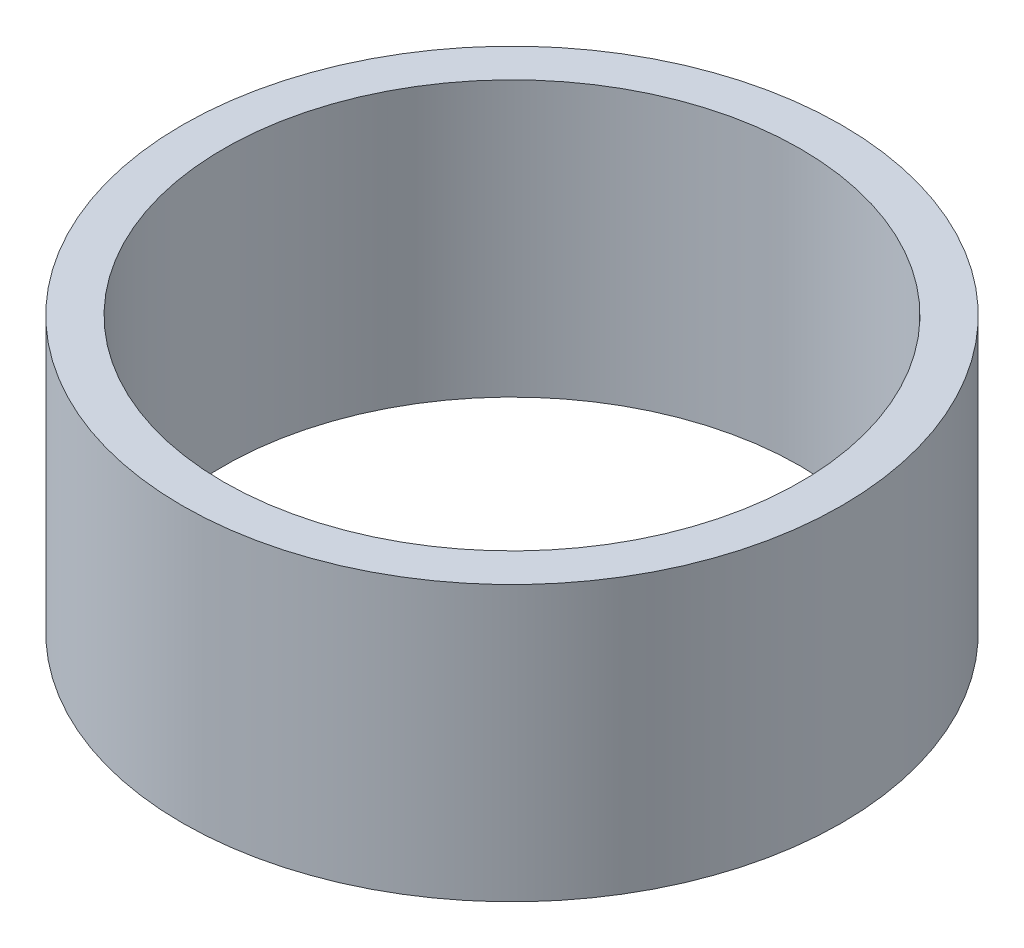
ISO-10303-21;
HEADER;
FILE_DESCRIPTION(('STEP AP214'),'2;1');
FILE_NAME('part.step','',(''),(''),'','','');
FILE_SCHEMA(('AUTOMOTIVE_DESIGN { 1 0 10303 214 1 1 1 1 }'));
ENDSEC;
DATA;
#1=APPLICATION_CONTEXT('core data for automotive mechanical design processes');
#2=APPLICATION_PROTOCOL_DEFINITION('international standard','automotive_design',2000,#1);
#3=PRODUCT_CONTEXT('',#1,'mechanical');
#4=PRODUCT('Part','Part','',(#3));
#5=PRODUCT_RELATED_PRODUCT_CATEGORY('part','',(#4));
#6=PRODUCT_DEFINITION_FORMATION('','',#4);
#7=PRODUCT_DEFINITION_CONTEXT('part definition',#1,'design');
#8=PRODUCT_DEFINITION('design','',#6,#7);
#9=PRODUCT_DEFINITION_SHAPE('','',#8);
#10=(LENGTH_UNIT() NAMED_UNIT(*) SI_UNIT(.MILLI.,.METRE.));
#11=(NAMED_UNIT(*) PLANE_ANGLE_UNIT() SI_UNIT($,.RADIAN.));
#12=(NAMED_UNIT(*) SI_UNIT($,.STERADIAN.) SOLID_ANGLE_UNIT());
#13=UNCERTAINTY_MEASURE_WITH_UNIT(LENGTH_MEASURE(1.E-05),#10,'distance_accuracy_value','');
#14=(GEOMETRIC_REPRESENTATION_CONTEXT(3) GLOBAL_UNCERTAINTY_ASSIGNED_CONTEXT((#13)) GLOBAL_UNIT_ASSIGNED_CONTEXT((#10,
#11,#12)) REPRESENTATION_CONTEXT('',''));
#15=CARTESIAN_POINT('',(0.,0.,0.));
#16=DIRECTION('',(0.,0.,1.));
#17=DIRECTION('',(1.,0.,0.));
#18=AXIS2_PLACEMENT_3D('',#15,#16,#17);
#19=CARTESIAN_POINT('',(0.,5.,0.));
#20=DIRECTION('',(0.,1.,0.));
#21=DIRECTION('',(0.,0.,1.));
#22=AXIS2_PLACEMENT_3D('',#19,#20,#21);
#23=PLANE('',#22);
#24=CARTESIAN_POINT('',(0.,5.,0.));
#25=DIRECTION('',(0.,1.,0.));
#26=DIRECTION('',(0.,0.,1.));
#27=AXIS2_PLACEMENT_3D('',#24,#25,#26);
#28=CIRCLE('',#27,6.);
#29=CARTESIAN_POINT('',(0.,5.,6.));
#30=VERTEX_POINT('',#29);
#31=EDGE_CURVE('E10',#30,#30,#28,.T.);
#32=ORIENTED_EDGE('',*,*,#31,.T.);
#33=EDGE_LOOP('',(#32));
#34=FACE_BOUND('',#33,.T.);
#35=CARTESIAN_POINT('',(0.,5.,0.));
#36=DIRECTION('',(0.,1.,0.));
#37=DIRECTION('',(0.,0.,1.));
#38=AXIS2_PLACEMENT_3D('',#35,#36,#37);
#39=CIRCLE('',#38,5.25);
#40=CARTESIAN_POINT('',(0.,5.,5.25));
#41=VERTEX_POINT('',#40);
#42=EDGE_CURVE('E56',#41,#41,#39,.T.);
#43=ORIENTED_EDGE('',*,*,#42,.F.);
#44=EDGE_LOOP('',(#43));
#45=FACE_BOUND('',#44,.T.);
#46=ADVANCED_FACE('F43',(#34,#45),#23,.T.);
#47=CARTESIAN_POINT('',(0.,0.,0.));
#48=DIRECTION('',(0.,1.,0.));
#49=DIRECTION('',(0.,0.,1.));
#50=AXIS2_PLACEMENT_3D('',#47,#48,#49);
#51=PLANE('',#50);
#52=CARTESIAN_POINT('',(0.,0.,0.));
#53=DIRECTION('',(0.,1.,0.));
#54=DIRECTION('',(0.,0.,1.));
#55=AXIS2_PLACEMENT_3D('',#52,#53,#54);
#56=CIRCLE('',#55,6.);
#57=CARTESIAN_POINT('',(0.,0.,6.));
#58=VERTEX_POINT('',#57);
#59=EDGE_CURVE('E47',#58,#58,#56,.T.);
#60=ORIENTED_EDGE('',*,*,#59,.F.);
#61=EDGE_LOOP('',(#60));
#62=FACE_BOUND('',#61,.T.);
#63=CARTESIAN_POINT('',(0.,0.,0.));
#64=DIRECTION('',(0.,1.,0.));
#65=DIRECTION('',(0.,0.,1.));
#66=AXIS2_PLACEMENT_3D('',#63,#64,#65);
#67=CIRCLE('',#66,5.25);
#68=CARTESIAN_POINT('',(0.,0.,5.25));
#69=VERTEX_POINT('',#68);
#70=EDGE_CURVE('E58',#69,#69,#67,.T.);
#71=ORIENTED_EDGE('',*,*,#70,.T.);
#72=EDGE_LOOP('',(#71));
#73=FACE_BOUND('',#72,.T.);
#74=ADVANCED_FACE('F70',(#62,#73),#51,.F.);
#75=CARTESIAN_POINT('',(0.,5.,0.));
#76=DIRECTION('',(0.,-1.,0.));
#77=DIRECTION('',(0.,0.,-1.));
#78=AXIS2_PLACEMENT_3D('',#75,#76,#77);
#79=CYLINDRICAL_SURFACE('',#78,6.);
#80=ORIENTED_EDGE('',*,*,#31,.F.);
#81=EDGE_LOOP('',(#80));
#82=FACE_BOUND('',#81,.T.);
#83=ORIENTED_EDGE('',*,*,#59,.T.);
#84=EDGE_LOOP('',(#83));
#85=FACE_BOUND('',#84,.T.);
#86=ADVANCED_FACE('F45',(#82,#85),#79,.T.);
#87=CARTESIAN_POINT('',(0.,5.,0.));
#88=DIRECTION('',(0.,-1.,0.));
#89=DIRECTION('',(0.,0.,-1.));
#90=AXIS2_PLACEMENT_3D('',#87,#88,#89);
#91=CYLINDRICAL_SURFACE('',#90,5.25);
#92=ORIENTED_EDGE('',*,*,#42,.T.);
#93=EDGE_LOOP('',(#92));
#94=FACE_BOUND('',#93,.T.);
#95=ORIENTED_EDGE('',*,*,#70,.F.);
#96=EDGE_LOOP('',(#95));
#97=FACE_BOUND('',#96,.T.);
#98=ADVANCED_FACE('F66',(#94,#97),#91,.F.);
#99=CLOSED_SHELL('',(#46,#74,#86,#98));
#100=MANIFOLD_SOLID_BREP('B2',#99);
#101=ADVANCED_BREP_SHAPE_REPRESENTATION('',(#18,#100),#14);
#102=SHAPE_DEFINITION_REPRESENTATION(#9,#101);
ENDSEC;
END-ISO-10303-21;
